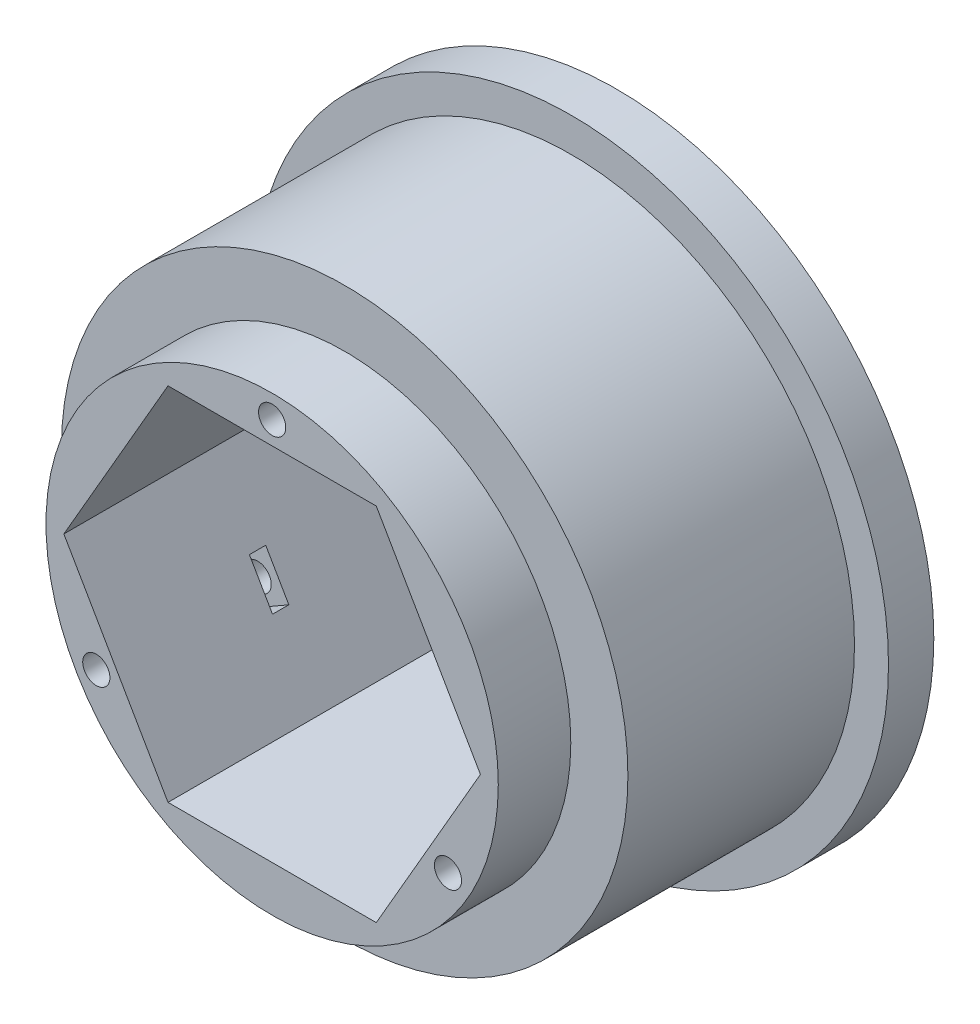
ISO-10303-21;
HEADER;
FILE_DESCRIPTION(('STEP AP214'),'2;1');
FILE_NAME('part.step','',(''),(''),'','','');
FILE_SCHEMA(('AUTOMOTIVE_DESIGN { 1 0 10303 214 1 1 1 1 }'));
ENDSEC;
DATA;
#1=APPLICATION_CONTEXT('core data for automotive mechanical design processes');
#2=APPLICATION_PROTOCOL_DEFINITION('international standard','automotive_design',2000,#1);
#3=PRODUCT_CONTEXT('',#1,'mechanical');
#4=PRODUCT('Part','Part','',(#3));
#5=PRODUCT_RELATED_PRODUCT_CATEGORY('part','',(#4));
#6=PRODUCT_DEFINITION_FORMATION('','',#4);
#7=PRODUCT_DEFINITION_CONTEXT('part definition',#1,'design');
#8=PRODUCT_DEFINITION('design','',#6,#7);
#9=PRODUCT_DEFINITION_SHAPE('','',#8);
#10=(LENGTH_UNIT() NAMED_UNIT(*) SI_UNIT(.MILLI.,.METRE.));
#11=(NAMED_UNIT(*) PLANE_ANGLE_UNIT() SI_UNIT($,.RADIAN.));
#12=(NAMED_UNIT(*) SI_UNIT($,.STERADIAN.) SOLID_ANGLE_UNIT());
#13=UNCERTAINTY_MEASURE_WITH_UNIT(LENGTH_MEASURE(1.E-05),#10,'distance_accuracy_value','');
#14=(GEOMETRIC_REPRESENTATION_CONTEXT(3) GLOBAL_UNCERTAINTY_ASSIGNED_CONTEXT((#13)) GLOBAL_UNIT_ASSIGNED_CONTEXT((#10,
#11,#12)) REPRESENTATION_CONTEXT('',''));
#15=CARTESIAN_POINT('',(0.,0.,0.));
#16=DIRECTION('',(0.,0.,1.));
#17=DIRECTION('',(1.,0.,0.));
#18=AXIS2_PLACEMENT_3D('',#15,#16,#17);
#19=CARTESIAN_POINT('',(42.,0.,5.00000000000001));
#20=DIRECTION('',(0.,0.,1.));
#21=DIRECTION('',(1.,0.,0.));
#22=AXIS2_PLACEMENT_3D('',#19,#20,#21);
#23=PLANE('',#22);
#24=CARTESIAN_POINT('',(0.,0.,5.00000000000001));
#25=DIRECTION('',(0.,0.,1.));
#26=DIRECTION('',(1.,0.,0.));
#27=AXIS2_PLACEMENT_3D('',#24,#25,#26);
#28=CIRCLE('',#27,31.25);
#29=CARTESIAN_POINT('',(31.25,0.,5.00000000000001));
#30=VERTEX_POINT('',#29);
#31=EDGE_CURVE('E340',#30,#30,#28,.T.);
#32=ORIENTED_EDGE('',*,*,#31,.F.);
#33=EDGE_LOOP('',(#32));
#34=FACE_BOUND('',#33,.T.);
#35=CARTESIAN_POINT('',(0.,0.,5.));
#36=DIRECTION('',(0.,0.,1.));
#37=DIRECTION('',(1.,0.,0.));
#38=AXIS2_PLACEMENT_3D('',#35,#36,#37);
#39=CIRCLE('',#38,35.);
#40=CARTESIAN_POINT('',(35.,0.,5.));
#41=VERTEX_POINT('',#40);
#42=EDGE_CURVE('E267',#41,#41,#39,.F.);
#43=ORIENTED_EDGE('',*,*,#42,.F.);
#44=EDGE_LOOP('',(#43));
#45=FACE_BOUND('',#44,.T.);
#46=ADVANCED_FACE('F44',(#34,#45),#23,.T.);
#47=CARTESIAN_POINT('',(28.1,0.,0.));
#48=DIRECTION('',(0.,0.,-1.));
#49=DIRECTION('',(-1.,0.,0.));
#50=AXIS2_PLACEMENT_3D('',#47,#48,#49);
#51=PLANE('',#50);
#52=CARTESIAN_POINT('',(0.,0.,0.));
#53=DIRECTION('',(0.,0.,1.));
#54=DIRECTION('',(1.,0.,0.));
#55=AXIS2_PLACEMENT_3D('',#52,#53,#54);
#56=CIRCLE('',#55,28.1);
#57=CARTESIAN_POINT('',(28.1,0.,0.));
#58=VERTEX_POINT('',#57);
#59=EDGE_CURVE('E337',#58,#58,#56,.T.);
#60=ORIENTED_EDGE('',*,*,#59,.T.);
#61=EDGE_LOOP('',(#60));
#62=FACE_BOUND('',#61,.T.);
#63=CARTESIAN_POINT('',(0.,0.,0.));
#64=DIRECTION('',(0.,0.,1.));
#65=DIRECTION('',(1.,0.,0.));
#66=AXIS2_PLACEMENT_3D('',#63,#64,#65);
#67=CIRCLE('',#66,35.);
#68=CARTESIAN_POINT('',(35.,0.,0.));
#69=VERTEX_POINT('',#68);
#70=EDGE_CURVE('E466',#69,#69,#67,.T.);
#71=ORIENTED_EDGE('',*,*,#70,.F.);
#72=EDGE_LOOP('',(#71));
#73=FACE_BOUND('',#72,.T.);
#74=ADVANCED_FACE('F408',(#62,#73),#51,.T.);
#75=CARTESIAN_POINT('',(-19.39896904477,-11.2000000000008,18.));
#76=DIRECTION('',(0.,0.,1.));
#77=DIRECTION('',(1.,0.,0.));
#78=AXIS2_PLACEMENT_3D('',#75,#76,#77);
#79=CYLINDRICAL_SURFACE('',#78,1.50000000000182);
#80=CARTESIAN_POINT('',(-19.39896904477,-11.2000000000008,38.));
#81=DIRECTION('',(0.,0.,1.));
#82=DIRECTION('',(1.,0.,0.));
#83=AXIS2_PLACEMENT_3D('',#80,#81,#82);
#84=CIRCLE('',#83,1.50000000000182);
#85=CARTESIAN_POINT('',(-17.8989690447682,-11.2000000000008,38.));
#86=VERTEX_POINT('',#85);
#87=EDGE_CURVE('E299',#86,#86,#84,.T.);
#88=ORIENTED_EDGE('',*,*,#87,.T.);
#89=EDGE_LOOP('',(#88));
#90=FACE_BOUND('',#89,.T.);
#91=CARTESIAN_POINT('',(-19.39896904477,-11.2000000000008,22.));
#92=DIRECTION('',(0.,0.,-1.));
#93=DIRECTION('',(-1.,0.,0.));
#94=AXIS2_PLACEMENT_3D('',#91,#92,#93);
#95=CIRCLE('',#94,1.50000000000182);
#96=CARTESIAN_POINT('',(-20.8989690447718,-11.2000000000008,22.));
#97=VERTEX_POINT('',#96);
#98=EDGE_CURVE('E379',#97,#97,#95,.F.);
#99=ORIENTED_EDGE('',*,*,#98,.F.);
#100=EDGE_LOOP('',(#99));
#101=FACE_BOUND('',#100,.T.);
#102=ADVANCED_FACE('F414',(#90,#101),#79,.F.);
#103=CARTESIAN_POINT('',(19.3989690447729,-11.1999999999992,18.));
#104=DIRECTION('',(0.,0.,1.));
#105=DIRECTION('',(1.,0.,0.));
#106=AXIS2_PLACEMENT_3D('',#103,#104,#105);
#107=CYLINDRICAL_SURFACE('',#106,1.50000000000123);
#108=CARTESIAN_POINT('',(19.3989690447729,-11.1999999999992,38.));
#109=DIRECTION('',(0.,0.,1.));
#110=DIRECTION('',(1.,0.,0.));
#111=AXIS2_PLACEMENT_3D('',#108,#109,#110);
#112=CIRCLE('',#111,1.50000000000123);
#113=CARTESIAN_POINT('',(20.8989690447741,-11.1999999999992,38.));
#114=VERTEX_POINT('',#113);
#115=EDGE_CURVE('E293',#114,#114,#112,.T.);
#116=ORIENTED_EDGE('',*,*,#115,.T.);
#117=EDGE_LOOP('',(#116));
#118=FACE_BOUND('',#117,.T.);
#119=CARTESIAN_POINT('',(19.3989690447729,-11.1999999999992,22.));
#120=DIRECTION('',(0.,0.,-1.));
#121=DIRECTION('',(-1.,0.,0.));
#122=AXIS2_PLACEMENT_3D('',#119,#120,#121);
#123=CIRCLE('',#122,1.50000000000123);
#124=CARTESIAN_POINT('',(17.8989690447716,-11.1999999999992,22.));
#125=VERTEX_POINT('',#124);
#126=EDGE_CURVE('E374',#125,#125,#123,.F.);
#127=ORIENTED_EDGE('',*,*,#126,.F.);
#128=EDGE_LOOP('',(#127));
#129=FACE_BOUND('',#128,.T.);
#130=ADVANCED_FACE('F405',(#118,#129),#107,.F.);
#131=CARTESIAN_POINT('',(0.,22.4,18.));
#132=DIRECTION('',(0.,0.,1.));
#133=DIRECTION('',(1.,0.,0.));
#134=AXIS2_PLACEMENT_3D('',#131,#132,#133);
#135=CYLINDRICAL_SURFACE('',#134,1.5);
#136=CARTESIAN_POINT('',(0.,22.4,38.));
#137=DIRECTION('',(0.,0.,1.));
#138=DIRECTION('',(1.,0.,0.));
#139=AXIS2_PLACEMENT_3D('',#136,#137,#138);
#140=CIRCLE('',#139,1.5);
#141=CARTESIAN_POINT('',(1.50000000000001,22.4,38.));
#142=VERTEX_POINT('',#141);
#143=EDGE_CURVE('E287',#142,#142,#140,.T.);
#144=ORIENTED_EDGE('',*,*,#143,.T.);
#145=EDGE_LOOP('',(#144));
#146=FACE_BOUND('',#145,.T.);
#147=CARTESIAN_POINT('',(0.,22.4,22.));
#148=DIRECTION('',(0.,0.,-1.));
#149=DIRECTION('',(-1.,0.,0.));
#150=AXIS2_PLACEMENT_3D('',#147,#148,#149);
#151=CIRCLE('',#150,1.5);
#152=CARTESIAN_POINT('',(-1.5,22.4,22.));
#153=VERTEX_POINT('',#152);
#154=EDGE_CURVE('E214',#153,#153,#151,.F.);
#155=ORIENTED_EDGE('',*,*,#154,.F.);
#156=EDGE_LOOP('',(#155));
#157=FACE_BOUND('',#156,.T.);
#158=ADVANCED_FACE('F443',(#146,#157),#135,.F.);
#159=CARTESIAN_POINT('',(0.,0.,57.8257955505955));
#160=DIRECTION('',(0.,0.,1.));
#161=DIRECTION('',(1.,0.,0.));
#162=AXIS2_PLACEMENT_3D('',#159,#160,#161);
#163=CYLINDRICAL_SURFACE('',#162,24.95);
#164=CARTESIAN_POINT('',(0.,0.,5.));
#165=DIRECTION('',(0.,0.,1.));
#166=DIRECTION('',(1.,0.,0.));
#167=AXIS2_PLACEMENT_3D('',#164,#165,#166);
#168=CIRCLE('',#167,24.95);
#169=CARTESIAN_POINT('',(24.95,0.,5.));
#170=VERTEX_POINT('',#169);
#171=EDGE_CURVE('E352',#170,#170,#168,.T.);
#172=ORIENTED_EDGE('',*,*,#171,.T.);
#173=EDGE_LOOP('',(#172));
#174=FACE_BOUND('',#173,.T.);
#175=CARTESIAN_POINT('',(0.,0.,10.));
#176=DIRECTION('',(0.,0.,1.));
#177=DIRECTION('',(1.,0.,0.));
#178=AXIS2_PLACEMENT_3D('',#175,#176,#177);
#179=CIRCLE('',#178,24.95);
#180=CARTESIAN_POINT('',(24.95,0.,10.));
#181=VERTEX_POINT('',#180);
#182=EDGE_CURVE('E331',#181,#181,#179,.T.);
#183=ORIENTED_EDGE('',*,*,#182,.F.);
#184=EDGE_LOOP('',(#183));
#185=FACE_BOUND('',#184,.T.);
#186=ADVANCED_FACE('F46',(#174,#185),#163,.T.);
#187=CARTESIAN_POINT('',(19.9,0.,5.));
#188=DIRECTION('',(0.,0.,-1.));
#189=DIRECTION('',(-1.,0.,0.));
#190=AXIS2_PLACEMENT_3D('',#187,#188,#189);
#191=PLANE('',#190);
#192=DIRECTION('',(0.5,0.866025403784439,0.));
#193=VECTOR('',#192,1.);
#194=CARTESIAN_POINT('',(-12.2589055353103,18.5669527676552,5.));
#195=LINE('',#194,#193);
#196=CARTESIAN_POINT('',(-22.9785407137471,0.,5.));
#197=VERTEX_POINT('',#196);
#198=CARTESIAN_POINT('',(-11.4892703568736,19.9,5.));
#199=VERTEX_POINT('',#198);
#200=EDGE_CURVE('E329',#197,#199,#195,.T.);
#201=ORIENTED_EDGE('',*,*,#200,.F.);
#202=DIRECTION('',(-0.5,0.866025403784439,0.));
#203=VECTOR('',#202,1.);
#204=CARTESIAN_POINT('',(-12.2589055353103,-18.5669527676552,5.));
#205=LINE('',#204,#203);
#206=CARTESIAN_POINT('',(-11.4892703568736,-19.9,5.));
#207=VERTEX_POINT('',#206);
#208=EDGE_CURVE('E305',#207,#197,#205,.T.);
#209=ORIENTED_EDGE('',*,*,#208,.F.);
#210=DIRECTION('',(-1.,0.,0.));
#211=VECTOR('',#210,1.);
#212=CARTESIAN_POINT('',(19.9,-19.9,5.));
#213=LINE('',#212,#211);
#214=CARTESIAN_POINT('',(11.4892703568736,-19.9,5.));
#215=VERTEX_POINT('',#214);
#216=EDGE_CURVE('E321',#215,#207,#213,.T.);
#217=ORIENTED_EDGE('',*,*,#216,.F.);
#218=DIRECTION('',(-0.5,-0.866025403784439,0.));
#219=VECTOR('',#218,1.);
#220=CARTESIAN_POINT('',(22.2089055353103,-1.33304723234484,5.));
#221=LINE('',#220,#219);
#222=CARTESIAN_POINT('',(22.9785407137471,0.,5.));
#223=VERTEX_POINT('',#222);
#224=EDGE_CURVE('E323',#223,#215,#221,.T.);
#225=ORIENTED_EDGE('',*,*,#224,.F.);
#226=DIRECTION('',(0.5,-0.866025403784439,0.));
#227=VECTOR('',#226,1.);
#228=CARTESIAN_POINT('',(22.2089055353103,1.33304723234484,5.));
#229=LINE('',#228,#227);
#230=CARTESIAN_POINT('',(11.4892703568736,19.9,5.));
#231=VERTEX_POINT('',#230);
#232=EDGE_CURVE('E325',#231,#223,#229,.T.);
#233=ORIENTED_EDGE('',*,*,#232,.F.);
#234=DIRECTION('',(1.,0.,0.));
#235=VECTOR('',#234,1.);
#236=CARTESIAN_POINT('',(19.9,19.9,5.));
#237=LINE('',#236,#235);
#238=EDGE_CURVE('E327',#199,#231,#237,.T.);
#239=ORIENTED_EDGE('',*,*,#238,.F.);
#240=EDGE_LOOP('',(#201,#209,#217,#225,#233,#239));
#241=FACE_BOUND('',#240,.T.);
#242=ORIENTED_EDGE('',*,*,#171,.F.);
#243=EDGE_LOOP('',(#242));
#244=FACE_BOUND('',#243,.T.);
#245=ADVANCED_FACE('F436',(#241,#244),#191,.T.);
#246=CARTESIAN_POINT('',(24.95,0.,38.));
#247=DIRECTION('',(0.,0.,1.));
#248=DIRECTION('',(1.,0.,0.));
#249=AXIS2_PLACEMENT_3D('',#246,#247,#248);
#250=PLANE('',#249);
#251=ORIENTED_EDGE('',*,*,#143,.F.);
#252=EDGE_LOOP('',(#251));
#253=FACE_BOUND('',#252,.T.);
#254=ORIENTED_EDGE('',*,*,#115,.F.);
#255=EDGE_LOOP('',(#254));
#256=FACE_BOUND('',#255,.T.);
#257=ORIENTED_EDGE('',*,*,#87,.F.);
#258=EDGE_LOOP('',(#257));
#259=FACE_BOUND('',#258,.T.);
#260=DIRECTION('',(-0.5,0.866025403784439,0.));
#261=VECTOR('',#260,1.);
#262=CARTESIAN_POINT('',(23.4714055353103,-0.853666912210862,38.));
#263=LINE('',#262,#261);
#264=CARTESIAN_POINT('',(22.9785407137471,0.,38.));
#265=VERTEX_POINT('',#264);
#266=CARTESIAN_POINT('',(11.4892703568736,19.9,38.));
#267=VERTEX_POINT('',#266);
#268=EDGE_CURVE('E12',#265,#267,#263,.T.);
#269=ORIENTED_EDGE('',*,*,#268,.F.);
#270=DIRECTION('',(0.5,0.866025403784439,0.));
#271=VECTOR('',#270,1.);
#272=CARTESIAN_POINT('',(23.4714055353103,0.853666912210868,38.));
#273=LINE('',#272,#271);
#274=CARTESIAN_POINT('',(11.4892703568736,-19.9,38.));
#275=VERTEX_POINT('',#274);
#276=EDGE_CURVE('E53',#275,#265,#273,.T.);
#277=ORIENTED_EDGE('',*,*,#276,.F.);
#278=DIRECTION('',(1.,0.,0.));
#279=VECTOR('',#278,1.);
#280=CARTESIAN_POINT('',(24.95,-19.9,38.));
#281=LINE('',#280,#279);
#282=CARTESIAN_POINT('',(-11.4892703568736,-19.9,38.));
#283=VERTEX_POINT('',#282);
#284=EDGE_CURVE('E359',#283,#275,#281,.T.);
#285=ORIENTED_EDGE('',*,*,#284,.F.);
#286=DIRECTION('',(0.5,-0.866025403784439,0.));
#287=VECTOR('',#286,1.);
#288=CARTESIAN_POINT('',(-10.9964055353103,-20.7536669122109,38.));
#289=LINE('',#288,#287);
#290=CARTESIAN_POINT('',(-22.9785407137471,0.,38.));
#291=VERTEX_POINT('',#290);
#292=EDGE_CURVE('E355',#291,#283,#289,.T.);
#293=ORIENTED_EDGE('',*,*,#292,.F.);
#294=DIRECTION('',(-0.5,-0.866025403784439,0.));
#295=VECTOR('',#294,1.);
#296=CARTESIAN_POINT('',(-10.9964055353103,20.7536669122109,38.));
#297=LINE('',#296,#295);
#298=CARTESIAN_POINT('',(-11.4892703568736,19.9,38.));
#299=VERTEX_POINT('',#298);
#300=EDGE_CURVE('E358',#299,#291,#297,.T.);
#301=ORIENTED_EDGE('',*,*,#300,.F.);
#302=DIRECTION('',(-1.,0.,0.));
#303=VECTOR('',#302,1.);
#304=CARTESIAN_POINT('',(24.95,19.9,38.));
#305=LINE('',#304,#303);
#306=EDGE_CURVE('E362',#267,#299,#305,.T.);
#307=ORIENTED_EDGE('',*,*,#306,.F.);
#308=EDGE_LOOP('',(#269,#277,#285,#293,#301,#307));
#309=FACE_BOUND('',#308,.T.);
#310=CARTESIAN_POINT('',(0.,0.,38.));
#311=DIRECTION('',(0.,0.,1.));
#312=DIRECTION('',(1.,0.,0.));
#313=AXIS2_PLACEMENT_3D('',#310,#311,#312);
#314=CIRCLE('',#313,24.95);
#315=CARTESIAN_POINT('',(24.95,0.,38.));
#316=VERTEX_POINT('',#315);
#317=EDGE_CURVE('E349',#316,#316,#314,.T.);
#318=ORIENTED_EDGE('',*,*,#317,.T.);
#319=EDGE_LOOP('',(#318));
#320=FACE_BOUND('',#319,.T.);
#321=ADVANCED_FACE('F433',(#253,#256,#259,#309,#320),#250,.T.);
#322=CARTESIAN_POINT('',(0.,0.,57.8257955505955));
#323=DIRECTION('',(0.,0.,1.));
#324=DIRECTION('',(1.,0.,0.));
#325=AXIS2_PLACEMENT_3D('',#322,#323,#324);
#326=CYLINDRICAL_SURFACE('',#325,24.95);
#327=CARTESIAN_POINT('',(0.,0.,30.));
#328=DIRECTION('',(0.,0.,1.));
#329=DIRECTION('',(1.,0.,0.));
#330=AXIS2_PLACEMENT_3D('',#327,#328,#329);
#331=CIRCLE('',#330,24.95);
#332=CARTESIAN_POINT('',(24.95,0.,30.));
#333=VERTEX_POINT('',#332);
#334=EDGE_CURVE('E346',#333,#333,#331,.T.);
#335=ORIENTED_EDGE('',*,*,#334,.T.);
#336=EDGE_LOOP('',(#335));
#337=FACE_BOUND('',#336,.T.);
#338=ORIENTED_EDGE('',*,*,#317,.F.);
#339=EDGE_LOOP('',(#338));
#340=FACE_BOUND('',#339,.T.);
#341=ADVANCED_FACE('F429',(#337,#340),#326,.T.);
#342=CARTESIAN_POINT('',(31.25,0.,30.));
#343=DIRECTION('',(0.,0.,1.));
#344=DIRECTION('',(1.,0.,0.));
#345=AXIS2_PLACEMENT_3D('',#342,#343,#344);
#346=PLANE('',#345);
#347=CARTESIAN_POINT('',(0.,0.,30.));
#348=DIRECTION('',(0.,0.,1.));
#349=DIRECTION('',(1.,0.,0.));
#350=AXIS2_PLACEMENT_3D('',#347,#348,#349);
#351=CIRCLE('',#350,31.25);
#352=CARTESIAN_POINT('',(31.25,0.,30.));
#353=VERTEX_POINT('',#352);
#354=EDGE_CURVE('E343',#353,#353,#351,.T.);
#355=ORIENTED_EDGE('',*,*,#354,.T.);
#356=EDGE_LOOP('',(#355));
#357=FACE_BOUND('',#356,.T.);
#358=ORIENTED_EDGE('',*,*,#334,.F.);
#359=EDGE_LOOP('',(#358));
#360=FACE_BOUND('',#359,.T.);
#361=ADVANCED_FACE('F425',(#357,#360),#346,.T.);
#362=CARTESIAN_POINT('',(0.,0.,57.8257955505955));
#363=DIRECTION('',(0.,0.,1.));
#364=DIRECTION('',(1.,0.,0.));
#365=AXIS2_PLACEMENT_3D('',#362,#363,#364);
#366=CYLINDRICAL_SURFACE('',#365,31.25);
#367=ORIENTED_EDGE('',*,*,#31,.T.);
#368=EDGE_LOOP('',(#367));
#369=FACE_BOUND('',#368,.T.);
#370=ORIENTED_EDGE('',*,*,#354,.F.);
#371=EDGE_LOOP('',(#370));
#372=FACE_BOUND('',#371,.T.);
#373=ADVANCED_FACE('F421',(#369,#372),#366,.T.);
#374=CARTESIAN_POINT('',(0.,0.,57.8257955505955));
#375=DIRECTION('',(0.,0.,1.));
#376=DIRECTION('',(1.,0.,0.));
#377=AXIS2_PLACEMENT_3D('',#374,#375,#376);
#378=CYLINDRICAL_SURFACE('',#377,28.1);
#379=CARTESIAN_POINT('',(0.,0.,10.));
#380=DIRECTION('',(0.,0.,1.));
#381=DIRECTION('',(1.,0.,0.));
#382=AXIS2_PLACEMENT_3D('',#379,#380,#381);
#383=CIRCLE('',#382,28.1);
#384=CARTESIAN_POINT('',(28.1,0.,10.));
#385=VERTEX_POINT('',#384);
#386=EDGE_CURVE('E334',#385,#385,#383,.T.);
#387=ORIENTED_EDGE('',*,*,#386,.T.);
#388=EDGE_LOOP('',(#387));
#389=FACE_BOUND('',#388,.T.);
#390=ORIENTED_EDGE('',*,*,#59,.F.);
#391=EDGE_LOOP('',(#390));
#392=FACE_BOUND('',#391,.T.);
#393=ADVANCED_FACE('F424',(#389,#392),#378,.F.);
#394=CARTESIAN_POINT('',(24.95,0.,10.));
#395=DIRECTION('',(0.,0.,-1.));
#396=DIRECTION('',(-1.,0.,0.));
#397=AXIS2_PLACEMENT_3D('',#394,#395,#396);
#398=PLANE('',#397);
#399=ORIENTED_EDGE('',*,*,#182,.T.);
#400=EDGE_LOOP('',(#399));
#401=FACE_BOUND('',#400,.T.);
#402=ORIENTED_EDGE('',*,*,#386,.F.);
#403=EDGE_LOOP('',(#402));
#404=FACE_BOUND('',#403,.T.);
#405=ADVANCED_FACE('F453',(#401,#404),#398,.T.);
#406=CARTESIAN_POINT('',(-11.4892703568736,19.9,0.));
#407=DIRECTION('',(-0.866025403784439,0.5,0.));
#408=DIRECTION('',(-0.5,-0.866025403784439,0.));
#409=AXIS2_PLACEMENT_3D('',#406,#407,#408);
#410=PLANE('',#409);
#411=ORIENTED_EDGE('',*,*,#200,.T.);
#412=DIRECTION('',(0.,0.,1.));
#413=VECTOR('',#412,1.);
#414=CARTESIAN_POINT('',(-11.4892703568736,19.9,0.));
#415=LINE('',#414,#413);
#416=EDGE_CURVE('E302',#199,#299,#415,.T.);
#417=ORIENTED_EDGE('',*,*,#416,.T.);
#418=ORIENTED_EDGE('',*,*,#300,.T.);
#419=DIRECTION('',(0.,0.,1.));
#420=VECTOR('',#419,1.);
#421=CARTESIAN_POINT('',(-22.9785407137471,0.,0.));
#422=LINE('',#421,#420);
#423=EDGE_CURVE('E286',#197,#291,#422,.T.);
#424=ORIENTED_EDGE('',*,*,#423,.F.);
#425=EDGE_LOOP('',(#411,#417,#418,#424));
#426=FACE_BOUND('',#425,.T.);
#427=ADVANCED_FACE('F456',(#426),#410,.F.);
#428=CARTESIAN_POINT('',(11.4892703568736,19.9,0.));
#429=DIRECTION('',(0.,1.,0.));
#430=DIRECTION('',(-1.,0.,0.));
#431=AXIS2_PLACEMENT_3D('',#428,#429,#430);
#432=PLANE('',#431);
#433=DIRECTION('',(0.,0.,1.));
#434=VECTOR('',#433,1.);
#435=CARTESIAN_POINT('',(2.55,19.9,20.2));
#436=LINE('',#435,#434);
#437=CARTESIAN_POINT('',(2.55,19.9,20.2));
#438=VERTEX_POINT('',#437);
#439=CARTESIAN_POINT('',(2.55,19.9,22.));
#440=VERTEX_POINT('',#439);
#441=EDGE_CURVE('E184',#438,#440,#436,.T.);
#442=ORIENTED_EDGE('',*,*,#441,.F.);
#443=DIRECTION('',(1.,0.,0.));
#444=VECTOR('',#443,1.);
#445=CARTESIAN_POINT('',(-2.55,19.9,20.2));
#446=LINE('',#445,#444);
#447=CARTESIAN_POINT('',(-2.55,19.9,20.2));
#448=VERTEX_POINT('',#447);
#449=EDGE_CURVE('E192',#448,#438,#446,.T.);
#450=ORIENTED_EDGE('',*,*,#449,.F.);
#451=DIRECTION('',(0.,0.,1.));
#452=VECTOR('',#451,1.);
#453=CARTESIAN_POINT('',(-2.55,19.9,20.2));
#454=LINE('',#453,#452);
#455=CARTESIAN_POINT('',(-2.55,19.9,22.));
#456=VERTEX_POINT('',#455);
#457=EDGE_CURVE('E174',#448,#456,#454,.T.);
#458=ORIENTED_EDGE('',*,*,#457,.T.);
#459=DIRECTION('',(1.,0.,0.));
#460=VECTOR('',#459,1.);
#461=CARTESIAN_POINT('',(-2.55,19.9,22.));
#462=LINE('',#461,#460);
#463=EDGE_CURVE('E206',#456,#440,#462,.T.);
#464=ORIENTED_EDGE('',*,*,#463,.T.);
#465=EDGE_LOOP('',(#442,#450,#458,#464));
#466=FACE_BOUND('',#465,.T.);
#467=ORIENTED_EDGE('',*,*,#238,.T.);
#468=DIRECTION('',(0.,0.,1.));
#469=VECTOR('',#468,1.);
#470=CARTESIAN_POINT('',(11.4892703568736,19.9,0.));
#471=LINE('',#470,#469);
#472=EDGE_CURVE('E306',#231,#267,#471,.T.);
#473=ORIENTED_EDGE('',*,*,#472,.T.);
#474=ORIENTED_EDGE('',*,*,#306,.T.);
#475=ORIENTED_EDGE('',*,*,#416,.F.);
#476=EDGE_LOOP('',(#467,#473,#474,#475));
#477=FACE_BOUND('',#476,.T.);
#478=ADVANCED_FACE('F197',(#466,#477),#432,.F.);
#479=CARTESIAN_POINT('',(22.9785407137471,0.,0.));
#480=DIRECTION('',(0.866025403784439,0.5,0.));
#481=DIRECTION('',(-0.5,0.866025403784439,0.));
#482=AXIS2_PLACEMENT_3D('',#479,#480,#481);
#483=PLANE('',#482);
#484=ORIENTED_EDGE('',*,*,#232,.T.);
#485=DIRECTION('',(0.,0.,1.));
#486=VECTOR('',#485,1.);
#487=CARTESIAN_POINT('',(22.9785407137471,0.,0.));
#488=LINE('',#487,#486);
#489=EDGE_CURVE('E309',#223,#265,#488,.T.);
#490=ORIENTED_EDGE('',*,*,#489,.T.);
#491=ORIENTED_EDGE('',*,*,#268,.T.);
#492=ORIENTED_EDGE('',*,*,#472,.F.);
#493=EDGE_LOOP('',(#484,#490,#491,#492));
#494=FACE_BOUND('',#493,.T.);
#495=ADVANCED_FACE('F547',(#494),#483,.F.);
#496=CARTESIAN_POINT('',(11.4892703568736,-19.9,0.));
#497=DIRECTION('',(0.866025403784439,-0.5,0.));
#498=DIRECTION('',(0.5,0.866025403784439,0.));
#499=AXIS2_PLACEMENT_3D('',#496,#497,#498);
#500=PLANE('',#499);
#501=DIRECTION('',(0.,0.,1.));
#502=VECTOR('',#501,1.);
#503=CARTESIAN_POINT('',(15.9589055353111,-12.1583647796497,20.2));
#504=LINE('',#503,#502);
#505=CARTESIAN_POINT('',(15.9589055353111,-12.1583647796497,20.2));
#506=VERTEX_POINT('',#505);
#507=CARTESIAN_POINT('',(15.9589055353111,-12.158364779649,22.));
#508=VERTEX_POINT('',#507);
#509=EDGE_CURVE('E245',#506,#508,#504,.T.);
#510=ORIENTED_EDGE('',*,*,#509,.F.);
#511=DIRECTION('',(-0.5,-0.866025403784439,0.));
#512=VECTOR('',#511,1.);
#513=CARTESIAN_POINT('',(18.5089055353111,-7.74163522034909,20.2));
#514=LINE('',#513,#512);
#515=CARTESIAN_POINT('',(18.5089055353111,-7.74163522034909,20.2));
#516=VERTEX_POINT('',#515);
#517=EDGE_CURVE('E221',#516,#506,#514,.T.);
#518=ORIENTED_EDGE('',*,*,#517,.F.);
#519=DIRECTION('',(0.,0.,1.));
#520=VECTOR('',#519,1.);
#521=CARTESIAN_POINT('',(18.5089055353111,-7.74163522034909,20.2));
#522=LINE('',#521,#520);
#523=CARTESIAN_POINT('',(18.5089055353111,-7.74163522034909,22.));
#524=VERTEX_POINT('',#523);
#525=EDGE_CURVE('E231',#516,#524,#522,.T.);
#526=ORIENTED_EDGE('',*,*,#525,.T.);
#527=DIRECTION('',(-0.5,-0.866025403784439,0.));
#528=VECTOR('',#527,1.);
#529=CARTESIAN_POINT('',(18.5089055353111,-7.74163522034909,22.));
#530=LINE('',#529,#528);
#531=EDGE_CURVE('E235',#524,#508,#530,.T.);
#532=ORIENTED_EDGE('',*,*,#531,.T.);
#533=EDGE_LOOP('',(#510,#518,#526,#532));
#534=FACE_BOUND('',#533,.T.);
#535=ORIENTED_EDGE('',*,*,#224,.T.);
#536=DIRECTION('',(0.,0.,1.));
#537=VECTOR('',#536,1.);
#538=CARTESIAN_POINT('',(11.4892703568736,-19.9,0.));
#539=LINE('',#538,#537);
#540=EDGE_CURVE('E312',#215,#275,#539,.T.);
#541=ORIENTED_EDGE('',*,*,#540,.T.);
#542=ORIENTED_EDGE('',*,*,#276,.T.);
#543=ORIENTED_EDGE('',*,*,#489,.F.);
#544=EDGE_LOOP('',(#535,#541,#542,#543));
#545=FACE_BOUND('',#544,.T.);
#546=ADVANCED_FACE('F523',(#534,#545),#500,.F.);
#547=CARTESIAN_POINT('',(-11.4892703568736,-19.9,0.));
#548=DIRECTION('',(0.,-1.,0.));
#549=DIRECTION('',(1.,0.,0.));
#550=AXIS2_PLACEMENT_3D('',#547,#548,#549);
#551=PLANE('',#550);
#552=ORIENTED_EDGE('',*,*,#216,.T.);
#553=DIRECTION('',(0.,0.,1.));
#554=VECTOR('',#553,1.);
#555=CARTESIAN_POINT('',(-11.4892703568736,-19.9,0.));
#556=LINE('',#555,#554);
#557=EDGE_CURVE('E315',#207,#283,#556,.T.);
#558=ORIENTED_EDGE('',*,*,#557,.T.);
#559=ORIENTED_EDGE('',*,*,#284,.T.);
#560=ORIENTED_EDGE('',*,*,#540,.F.);
#561=EDGE_LOOP('',(#552,#558,#559,#560));
#562=FACE_BOUND('',#561,.T.);
#563=ADVANCED_FACE('F553',(#562),#551,.F.);
#564=CARTESIAN_POINT('',(-22.9785407137471,0.,0.));
#565=DIRECTION('',(-0.866025403784439,-0.5,0.));
#566=DIRECTION('',(0.5,-0.866025403784439,0.));
#567=AXIS2_PLACEMENT_3D('',#564,#565,#566);
#568=PLANE('',#567);
#569=DIRECTION('',(0.,0.,1.));
#570=VECTOR('',#569,1.);
#571=CARTESIAN_POINT('',(-18.5089055353094,-7.74163522035007,20.2));
#572=LINE('',#571,#570);
#573=CARTESIAN_POINT('',(-18.5089055353094,-7.74163522035007,20.2));
#574=VERTEX_POINT('',#573);
#575=CARTESIAN_POINT('',(-18.5089055353101,-7.74163522035007,22.));
#576=VERTEX_POINT('',#575);
#577=EDGE_CURVE('E278',#574,#576,#572,.T.);
#578=ORIENTED_EDGE('',*,*,#577,.F.);
#579=DIRECTION('',(-0.5,0.866025403784439,0.));
#580=VECTOR('',#579,1.);
#581=CARTESIAN_POINT('',(-15.9589055353094,-12.1583647796507,20.2));
#582=LINE('',#581,#580);
#583=CARTESIAN_POINT('',(-15.9589055353094,-12.1583647796507,20.2));
#584=VERTEX_POINT('',#583);
#585=EDGE_CURVE('E252',#584,#574,#582,.T.);
#586=ORIENTED_EDGE('',*,*,#585,.F.);
#587=DIRECTION('',(0.,0.,1.));
#588=VECTOR('',#587,1.);
#589=CARTESIAN_POINT('',(-15.9589055353094,-12.1583647796507,20.2));
#590=LINE('',#589,#588);
#591=CARTESIAN_POINT('',(-15.9589055353094,-12.1583647796507,22.));
#592=VERTEX_POINT('',#591);
#593=EDGE_CURVE('E262',#584,#592,#590,.T.);
#594=ORIENTED_EDGE('',*,*,#593,.T.);
#595=DIRECTION('',(-0.5,0.866025403784439,0.));
#596=VECTOR('',#595,1.);
#597=CARTESIAN_POINT('',(-15.9589055353094,-12.1583647796507,22.));
#598=LINE('',#597,#596);
#599=EDGE_CURVE('E266',#592,#576,#598,.T.);
#600=ORIENTED_EDGE('',*,*,#599,.T.);
#601=EDGE_LOOP('',(#578,#586,#594,#600));
#602=FACE_BOUND('',#601,.T.);
#603=ORIENTED_EDGE('',*,*,#208,.T.);
#604=ORIENTED_EDGE('',*,*,#423,.T.);
#605=ORIENTED_EDGE('',*,*,#292,.T.);
#606=ORIENTED_EDGE('',*,*,#557,.F.);
#607=EDGE_LOOP('',(#603,#604,#605,#606));
#608=FACE_BOUND('',#607,.T.);
#609=ADVANCED_FACE('F484',(#602,#608),#568,.F.);
#610=CARTESIAN_POINT('',(0.,0.,20.2));
#611=DIRECTION('',(0.,0.,-1.));
#612=DIRECTION('',(-1.,0.,0.));
#613=AXIS2_PLACEMENT_3D('',#610,#611,#612);
#614=PLANE('',#613);
#615=DIRECTION('',(0.,-1.,0.));
#616=VECTOR('',#615,1.);
#617=CARTESIAN_POINT('',(-2.55,19.9,20.2));
#618=LINE('',#617,#616);
#619=CARTESIAN_POINT('',(-2.55,24.95,20.2));
#620=VERTEX_POINT('',#619);
#621=EDGE_CURVE('E177',#620,#448,#618,.T.);
#622=ORIENTED_EDGE('',*,*,#621,.T.);
#623=ORIENTED_EDGE('',*,*,#449,.T.);
#624=DIRECTION('',(0.,1.,0.));
#625=VECTOR('',#624,1.);
#626=CARTESIAN_POINT('',(2.55,24.95,20.2));
#627=LINE('',#626,#625);
#628=CARTESIAN_POINT('',(2.55,24.95,20.2));
#629=VERTEX_POINT('',#628);
#630=EDGE_CURVE('E199',#438,#629,#627,.T.);
#631=ORIENTED_EDGE('',*,*,#630,.T.);
#632=DIRECTION('',(-1.,0.,0.));
#633=VECTOR('',#632,1.);
#634=CARTESIAN_POINT('',(-2.55,24.95,20.2));
#635=LINE('',#634,#633);
#636=EDGE_CURVE('E185',#629,#620,#635,.T.);
#637=ORIENTED_EDGE('',*,*,#636,.T.);
#638=EDGE_LOOP('',(#622,#623,#631,#637));
#639=FACE_BOUND('',#638,.T.);
#640=CARTESIAN_POINT('',(0.,22.4,20.2));
#641=DIRECTION('',(0.,0.,-1.));
#642=DIRECTION('',(-1.,0.,0.));
#643=AXIS2_PLACEMENT_3D('',#640,#641,#642);
#644=CIRCLE('',#643,1.5);
#645=CARTESIAN_POINT('',(-1.5,22.4,20.2));
#646=VERTEX_POINT('',#645);
#647=EDGE_CURVE('E371',#646,#646,#644,.F.);
#648=ORIENTED_EDGE('',*,*,#647,.F.);
#649=EDGE_LOOP('',(#648));
#650=FACE_BOUND('',#649,.T.);
#651=ADVANCED_FACE('F189',(#639,#650),#614,.F.);
#652=CARTESIAN_POINT('',(0.,0.,22.));
#653=DIRECTION('',(0.,0.,-1.));
#654=DIRECTION('',(-1.,0.,0.));
#655=AXIS2_PLACEMENT_3D('',#652,#653,#654);
#656=PLANE('',#655);
#657=DIRECTION('',(0.,-1.,0.));
#658=VECTOR('',#657,1.);
#659=CARTESIAN_POINT('',(-2.55,19.9,22.));
#660=LINE('',#659,#658);
#661=CARTESIAN_POINT('',(-2.55,24.95,22.));
#662=VERTEX_POINT('',#661);
#663=EDGE_CURVE('E180',#662,#456,#660,.T.);
#664=ORIENTED_EDGE('',*,*,#663,.F.);
#665=DIRECTION('',(-1.,0.,0.));
#666=VECTOR('',#665,1.);
#667=CARTESIAN_POINT('',(-2.55,24.95,22.));
#668=LINE('',#667,#666);
#669=CARTESIAN_POINT('',(2.55,24.95,22.));
#670=VERTEX_POINT('',#669);
#671=EDGE_CURVE('E195',#670,#662,#668,.T.);
#672=ORIENTED_EDGE('',*,*,#671,.F.);
#673=DIRECTION('',(0.,1.,0.));
#674=VECTOR('',#673,1.);
#675=CARTESIAN_POINT('',(2.55,24.95,22.));
#676=LINE('',#675,#674);
#677=EDGE_CURVE('E61',#440,#670,#676,.T.);
#678=ORIENTED_EDGE('',*,*,#677,.F.);
#679=ORIENTED_EDGE('',*,*,#463,.F.);
#680=EDGE_LOOP('',(#664,#672,#678,#679));
#681=FACE_BOUND('',#680,.T.);
#682=ORIENTED_EDGE('',*,*,#154,.T.);
#683=EDGE_LOOP('',(#682));
#684=FACE_BOUND('',#683,.T.);
#685=ADVANCED_FACE('F483',(#681,#684),#656,.T.);
#686=CARTESIAN_POINT('',(-2.55,19.9,20.2));
#687=DIRECTION('',(-1.,0.,0.));
#688=DIRECTION('',(0.,-1.,0.));
#689=AXIS2_PLACEMENT_3D('',#686,#687,#688);
#690=PLANE('',#689);
#691=ORIENTED_EDGE('',*,*,#663,.T.);
#692=ORIENTED_EDGE('',*,*,#457,.F.);
#693=ORIENTED_EDGE('',*,*,#621,.F.);
#694=DIRECTION('',(0.,0.,1.));
#695=VECTOR('',#694,1.);
#696=CARTESIAN_POINT('',(-2.55,24.95,20.2));
#697=LINE('',#696,#695);
#698=EDGE_CURVE('E212',#620,#662,#697,.T.);
#699=ORIENTED_EDGE('',*,*,#698,.T.);
#700=EDGE_LOOP('',(#691,#692,#693,#699));
#701=FACE_BOUND('',#700,.T.);
#702=ADVANCED_FACE('F176',(#701),#690,.F.);
#703=CARTESIAN_POINT('',(-2.55,24.95,20.2));
#704=DIRECTION('',(0.,1.,0.));
#705=DIRECTION('',(0.,0.,1.));
#706=AXIS2_PLACEMENT_3D('',#703,#704,#705);
#707=PLANE('',#706);
#708=ORIENTED_EDGE('',*,*,#671,.T.);
#709=ORIENTED_EDGE('',*,*,#698,.F.);
#710=ORIENTED_EDGE('',*,*,#636,.F.);
#711=DIRECTION('',(0.,0.,1.));
#712=VECTOR('',#711,1.);
#713=CARTESIAN_POINT('',(2.55,24.95,20.2));
#714=LINE('',#713,#712);
#715=EDGE_CURVE('E215',#629,#670,#714,.T.);
#716=ORIENTED_EDGE('',*,*,#715,.T.);
#717=EDGE_LOOP('',(#708,#709,#710,#716));
#718=FACE_BOUND('',#717,.T.);
#719=ADVANCED_FACE('F487',(#718),#707,.F.);
#720=CARTESIAN_POINT('',(2.55,24.95,20.2));
#721=DIRECTION('',(1.,0.,0.));
#722=DIRECTION('',(0.,0.,-1.));
#723=AXIS2_PLACEMENT_3D('',#720,#721,#722);
#724=PLANE('',#723);
#725=ORIENTED_EDGE('',*,*,#677,.T.);
#726=ORIENTED_EDGE('',*,*,#715,.F.);
#727=ORIENTED_EDGE('',*,*,#630,.F.);
#728=ORIENTED_EDGE('',*,*,#441,.T.);
#729=EDGE_LOOP('',(#725,#726,#727,#728));
#730=FACE_BOUND('',#729,.T.);
#731=ADVANCED_FACE('F490',(#730),#724,.F.);
#732=CARTESIAN_POINT('',(0.,22.4,18.));
#733=DIRECTION('',(0.,0.,1.));
#734=DIRECTION('',(1.,0.,0.));
#735=AXIS2_PLACEMENT_3D('',#732,#733,#734);
#736=PLANE('',#735);
#737=CARTESIAN_POINT('',(0.,22.4,18.));
#738=DIRECTION('',(0.,0.,1.));
#739=DIRECTION('',(1.,0.,0.));
#740=AXIS2_PLACEMENT_3D('',#737,#738,#739);
#741=CIRCLE('',#740,1.5);
#742=CARTESIAN_POINT('',(1.50000000000001,22.4,18.));
#743=VERTEX_POINT('',#742);
#744=EDGE_CURVE('E283',#743,#743,#741,.T.);
#745=ORIENTED_EDGE('',*,*,#744,.T.);
#746=EDGE_LOOP('',(#745));
#747=FACE_BOUND('',#746,.T.);
#748=ADVANCED_FACE('F494',(#747),#736,.T.);
#749=ORIENTED_EDGE('',*,*,#647,.T.);
#750=EDGE_LOOP('',(#749));
#751=FACE_BOUND('',#750,.T.);
#752=ORIENTED_EDGE('',*,*,#744,.F.);
#753=EDGE_LOOP('',(#752));
#754=FACE_BOUND('',#753,.T.);
#755=ADVANCED_FACE('F502',(#751,#754),#135,.F.);
#756=CARTESIAN_POINT('',(0.,0.,20.2));
#757=DIRECTION('',(0.,0.,-1.));
#758=DIRECTION('',(-1.,0.,0.));
#759=AXIS2_PLACEMENT_3D('',#756,#757,#758);
#760=PLANE('',#759);
#761=DIRECTION('',(-0.866025403784439,0.5,0.));
#762=VECTOR('',#761,1.);
#763=CARTESIAN_POINT('',(18.5089055353111,-7.74163522034909,20.2));
#764=LINE('',#763,#762);
#765=CARTESIAN_POINT('',(22.8823338244225,-10.2666352203491,20.2));
#766=VERTEX_POINT('',#765);
#767=EDGE_CURVE('E218',#766,#516,#764,.T.);
#768=ORIENTED_EDGE('',*,*,#767,.T.);
#769=ORIENTED_EDGE('',*,*,#517,.T.);
#770=DIRECTION('',(0.866025403784439,-0.5,0.));
#771=VECTOR('',#770,1.);
#772=CARTESIAN_POINT('',(20.3323338244225,-14.6833647796497,20.2));
#773=LINE('',#772,#771);
#774=CARTESIAN_POINT('',(20.3323338244225,-14.6833647796497,20.2));
#775=VERTEX_POINT('',#774);
#776=EDGE_CURVE('E225',#506,#775,#773,.T.);
#777=ORIENTED_EDGE('',*,*,#776,.T.);
#778=DIRECTION('',(0.5,0.866025403784439,0.));
#779=VECTOR('',#778,1.);
#780=CARTESIAN_POINT('',(22.8823338244225,-10.2666352203491,20.2));
#781=LINE('',#780,#779);
#782=EDGE_CURVE('E228',#775,#766,#781,.T.);
#783=ORIENTED_EDGE('',*,*,#782,.T.);
#784=EDGE_LOOP('',(#768,#769,#777,#783));
#785=FACE_BOUND('',#784,.T.);
#786=CARTESIAN_POINT('',(19.3989690447729,-11.1999999999992,20.2));
#787=DIRECTION('',(0.,0.,-1.));
#788=DIRECTION('',(-1.,0.,0.));
#789=AXIS2_PLACEMENT_3D('',#786,#787,#788);
#790=CIRCLE('',#789,1.50000000000123);
#791=CARTESIAN_POINT('',(17.8989690447716,-11.1999999999992,20.2));
#792=VERTEX_POINT('',#791);
#793=EDGE_CURVE('E377',#792,#792,#790,.F.);
#794=ORIENTED_EDGE('',*,*,#793,.F.);
#795=EDGE_LOOP('',(#794));
#796=FACE_BOUND('',#795,.T.);
#797=ADVANCED_FACE('F498',(#785,#796),#760,.F.);
#798=CARTESIAN_POINT('',(0.,0.,22.));
#799=DIRECTION('',(0.,0.,-1.));
#800=DIRECTION('',(-1.,0.,0.));
#801=AXIS2_PLACEMENT_3D('',#798,#799,#800);
#802=PLANE('',#801);
#803=DIRECTION('',(-0.866025403784439,0.5,0.));
#804=VECTOR('',#803,1.);
#805=CARTESIAN_POINT('',(18.5089055353111,-7.74163522034909,22.));
#806=LINE('',#805,#804);
#807=CARTESIAN_POINT('',(22.8823338244225,-10.2666352203491,22.));
#808=VERTEX_POINT('',#807);
#809=EDGE_CURVE('E232',#808,#524,#806,.T.);
#810=ORIENTED_EDGE('',*,*,#809,.F.);
#811=DIRECTION('',(0.5,0.866025403784439,0.));
#812=VECTOR('',#811,1.);
#813=CARTESIAN_POINT('',(22.8823338244225,-10.2666352203491,22.));
#814=LINE('',#813,#812);
#815=CARTESIAN_POINT('',(20.3323338244225,-14.6833647796497,22.));
#816=VERTEX_POINT('',#815);
#817=EDGE_CURVE('E222',#816,#808,#814,.T.);
#818=ORIENTED_EDGE('',*,*,#817,.F.);
#819=DIRECTION('',(0.866025403784439,-0.5,0.));
#820=VECTOR('',#819,1.);
#821=CARTESIAN_POINT('',(20.3323338244225,-14.6833647796497,22.));
#822=LINE('',#821,#820);
#823=EDGE_CURVE('E69',#508,#816,#822,.T.);
#824=ORIENTED_EDGE('',*,*,#823,.F.);
#825=ORIENTED_EDGE('',*,*,#531,.F.);
#826=EDGE_LOOP('',(#810,#818,#824,#825));
#827=FACE_BOUND('',#826,.T.);
#828=ORIENTED_EDGE('',*,*,#126,.T.);
#829=EDGE_LOOP('',(#828));
#830=FACE_BOUND('',#829,.T.);
#831=ADVANCED_FACE('F501',(#827,#830),#802,.T.);
#832=CARTESIAN_POINT('',(18.5089055353111,-7.74163522034909,20.2));
#833=DIRECTION('',(0.5,0.866025403784439,0.));
#834=DIRECTION('',(-0.866025403784439,0.5,0.));
#835=AXIS2_PLACEMENT_3D('',#832,#833,#834);
#836=PLANE('',#835);
#837=ORIENTED_EDGE('',*,*,#809,.T.);
#838=ORIENTED_EDGE('',*,*,#525,.F.);
#839=ORIENTED_EDGE('',*,*,#767,.F.);
#840=DIRECTION('',(0.,0.,1.));
#841=VECTOR('',#840,1.);
#842=CARTESIAN_POINT('',(22.8823338244225,-10.2666352203491,20.2));
#843=LINE('',#842,#841);
#844=EDGE_CURVE('E207',#766,#808,#843,.T.);
#845=ORIENTED_EDGE('',*,*,#844,.T.);
#846=EDGE_LOOP('',(#837,#838,#839,#845));
#847=FACE_BOUND('',#846,.T.);
#848=ADVANCED_FACE('F506',(#847),#836,.F.);
#849=CARTESIAN_POINT('',(22.8823338244225,-10.2666352203491,20.2));
#850=DIRECTION('',(0.866025403784438,-0.5,0.));
#851=DIRECTION('',(0.5,0.866025403784439,0.));
#852=AXIS2_PLACEMENT_3D('',#849,#850,#851);
#853=PLANE('',#852);
#854=ORIENTED_EDGE('',*,*,#817,.T.);
#855=ORIENTED_EDGE('',*,*,#844,.F.);
#856=ORIENTED_EDGE('',*,*,#782,.F.);
#857=DIRECTION('',(0.,0.,1.));
#858=VECTOR('',#857,1.);
#859=CARTESIAN_POINT('',(20.3323338244225,-14.6833647796497,20.2));
#860=LINE('',#859,#858);
#861=EDGE_CURVE('E243',#775,#816,#860,.T.);
#862=ORIENTED_EDGE('',*,*,#861,.T.);
#863=EDGE_LOOP('',(#854,#855,#856,#862));
#864=FACE_BOUND('',#863,.T.);
#865=ADVANCED_FACE('F507',(#864),#853,.F.);
#866=CARTESIAN_POINT('',(20.3323338244225,-14.6833647796497,20.2));
#867=DIRECTION('',(-0.5,-0.866025403784439,0.));
#868=DIRECTION('',(0.866025403784439,-0.5,0.));
#869=AXIS2_PLACEMENT_3D('',#866,#867,#868);
#870=PLANE('',#869);
#871=ORIENTED_EDGE('',*,*,#823,.T.);
#872=ORIENTED_EDGE('',*,*,#861,.F.);
#873=ORIENTED_EDGE('',*,*,#776,.F.);
#874=ORIENTED_EDGE('',*,*,#509,.T.);
#875=EDGE_LOOP('',(#871,#872,#873,#874));
#876=FACE_BOUND('',#875,.T.);
#877=ADVANCED_FACE('F510',(#876),#870,.F.);
#878=CARTESIAN_POINT('',(19.3989690447729,-11.1999999999992,18.));
#879=DIRECTION('',(0.,0.,1.));
#880=DIRECTION('',(1.,0.,0.));
#881=AXIS2_PLACEMENT_3D('',#878,#879,#880);
#882=PLANE('',#881);
#883=CARTESIAN_POINT('',(19.3989690447729,-11.1999999999992,18.));
#884=DIRECTION('',(0.,0.,1.));
#885=DIRECTION('',(1.,0.,0.));
#886=AXIS2_PLACEMENT_3D('',#883,#884,#885);
#887=CIRCLE('',#886,1.50000000000123);
#888=CARTESIAN_POINT('',(20.8989690447741,-11.1999999999992,18.));
#889=VERTEX_POINT('',#888);
#890=EDGE_CURVE('E290',#889,#889,#887,.T.);
#891=ORIENTED_EDGE('',*,*,#890,.T.);
#892=EDGE_LOOP('',(#891));
#893=FACE_BOUND('',#892,.T.);
#894=ADVANCED_FACE('F402',(#893),#882,.T.);
#895=ORIENTED_EDGE('',*,*,#793,.T.);
#896=EDGE_LOOP('',(#895));
#897=FACE_BOUND('',#896,.T.);
#898=ORIENTED_EDGE('',*,*,#890,.F.);
#899=EDGE_LOOP('',(#898));
#900=FACE_BOUND('',#899,.T.);
#901=ADVANCED_FACE('F392',(#897,#900),#107,.F.);
#902=CARTESIAN_POINT('',(0.,0.,20.2));
#903=DIRECTION('',(0.,0.,-1.));
#904=DIRECTION('',(-1.,0.,0.));
#905=AXIS2_PLACEMENT_3D('',#902,#903,#904);
#906=PLANE('',#905);
#907=DIRECTION('',(0.866025403784438,0.500000000000001,0.));
#908=VECTOR('',#907,1.);
#909=CARTESIAN_POINT('',(-15.9589055353094,-12.1583647796507,20.2));
#910=LINE('',#909,#908);
#911=CARTESIAN_POINT('',(-20.3323338244208,-14.6833647796507,20.2));
#912=VERTEX_POINT('',#911);
#913=EDGE_CURVE('E249',#912,#584,#910,.T.);
#914=ORIENTED_EDGE('',*,*,#913,.T.);
#915=ORIENTED_EDGE('',*,*,#585,.T.);
#916=DIRECTION('',(-0.866025403784438,-0.5,0.));
#917=VECTOR('',#916,1.);
#918=CARTESIAN_POINT('',(-22.8823338244208,-10.2666352203501,20.2));
#919=LINE('',#918,#917);
#920=CARTESIAN_POINT('',(-22.8823338244208,-10.2666352203501,20.2));
#921=VERTEX_POINT('',#920);
#922=EDGE_CURVE('E256',#574,#921,#919,.T.);
#923=ORIENTED_EDGE('',*,*,#922,.T.);
#924=DIRECTION('',(0.5,-0.866025403784439,0.));
#925=VECTOR('',#924,1.);
#926=CARTESIAN_POINT('',(-20.3323338244208,-14.6833647796507,20.2));
#927=LINE('',#926,#925);
#928=EDGE_CURVE('E259',#921,#912,#927,.T.);
#929=ORIENTED_EDGE('',*,*,#928,.T.);
#930=EDGE_LOOP('',(#914,#915,#923,#929));
#931=FACE_BOUND('',#930,.T.);
#932=CARTESIAN_POINT('',(-19.39896904477,-11.2000000000008,20.2));
#933=DIRECTION('',(0.,0.,-1.));
#934=DIRECTION('',(-1.,0.,0.));
#935=AXIS2_PLACEMENT_3D('',#932,#933,#934);
#936=CIRCLE('',#935,1.50000000000182);
#937=CARTESIAN_POINT('',(-20.8989690447718,-11.2000000000008,20.2));
#938=VERTEX_POINT('',#937);
#939=EDGE_CURVE('E48',#938,#938,#936,.F.);
#940=ORIENTED_EDGE('',*,*,#939,.F.);
#941=EDGE_LOOP('',(#940));
#942=FACE_BOUND('',#941,.T.);
#943=ADVANCED_FACE('F389',(#931,#942),#906,.F.);
#944=CARTESIAN_POINT('',(0.,0.,22.));
#945=DIRECTION('',(0.,0.,-1.));
#946=DIRECTION('',(-1.,0.,0.));
#947=AXIS2_PLACEMENT_3D('',#944,#945,#946);
#948=PLANE('',#947);
#949=DIRECTION('',(0.866025403784438,0.500000000000001,0.));
#950=VECTOR('',#949,1.);
#951=CARTESIAN_POINT('',(-15.9589055353094,-12.1583647796507,22.));
#952=LINE('',#951,#950);
#953=CARTESIAN_POINT('',(-20.3323338244208,-14.6833647796507,22.));
#954=VERTEX_POINT('',#953);
#955=EDGE_CURVE('E263',#954,#592,#952,.T.);
#956=ORIENTED_EDGE('',*,*,#955,.F.);
#957=DIRECTION('',(0.5,-0.866025403784439,0.));
#958=VECTOR('',#957,1.);
#959=CARTESIAN_POINT('',(-20.3323338244208,-14.6833647796507,22.));
#960=LINE('',#959,#958);
#961=CARTESIAN_POINT('',(-22.8823338244208,-10.2666352203501,22.));
#962=VERTEX_POINT('',#961);
#963=EDGE_CURVE('E253',#962,#954,#960,.T.);
#964=ORIENTED_EDGE('',*,*,#963,.F.);
#965=DIRECTION('',(-0.866025403784438,-0.5,0.));
#966=VECTOR('',#965,1.);
#967=CARTESIAN_POINT('',(-22.8823338244208,-10.2666352203501,22.));
#968=LINE('',#967,#966);
#969=EDGE_CURVE('E270',#576,#962,#968,.T.);
#970=ORIENTED_EDGE('',*,*,#969,.F.);
#971=ORIENTED_EDGE('',*,*,#599,.F.);
#972=EDGE_LOOP('',(#956,#964,#970,#971));
#973=FACE_BOUND('',#972,.T.);
#974=ORIENTED_EDGE('',*,*,#98,.T.);
#975=EDGE_LOOP('',(#974));
#976=FACE_BOUND('',#975,.T.);
#977=ADVANCED_FACE('F391',(#973,#976),#948,.T.);
#978=CARTESIAN_POINT('',(-15.9589055353094,-12.1583647796507,20.2));
#979=DIRECTION('',(0.500000000000001,-0.866025403784438,0.));
#980=DIRECTION('',(0.866025403784438,0.500000000000001,0.));
#981=AXIS2_PLACEMENT_3D('',#978,#979,#980);
#982=PLANE('',#981);
#983=ORIENTED_EDGE('',*,*,#955,.T.);
#984=ORIENTED_EDGE('',*,*,#593,.F.);
#985=ORIENTED_EDGE('',*,*,#913,.F.);
#986=DIRECTION('',(0.,0.,1.));
#987=VECTOR('',#986,1.);
#988=CARTESIAN_POINT('',(-20.3323338244208,-14.6833647796507,20.2));
#989=LINE('',#988,#987);
#990=EDGE_CURVE('E236',#912,#954,#989,.T.);
#991=ORIENTED_EDGE('',*,*,#990,.T.);
#992=EDGE_LOOP('',(#983,#984,#985,#991));
#993=FACE_BOUND('',#992,.T.);
#994=ADVANCED_FACE('F399',(#993),#982,.F.);
#995=CARTESIAN_POINT('',(-20.3323338244208,-14.6833647796507,20.2));
#996=DIRECTION('',(-0.866025403784438,-0.5,0.));
#997=DIRECTION('',(0.5,-0.866025403784439,0.));
#998=AXIS2_PLACEMENT_3D('',#995,#996,#997);
#999=PLANE('',#998);
#1000=ORIENTED_EDGE('',*,*,#963,.T.);
#1001=ORIENTED_EDGE('',*,*,#990,.F.);
#1002=ORIENTED_EDGE('',*,*,#928,.F.);
#1003=DIRECTION('',(0.,0.,1.));
#1004=VECTOR('',#1003,1.);
#1005=CARTESIAN_POINT('',(-22.8823338244208,-10.2666352203501,20.2));
#1006=LINE('',#1005,#1004);
#1007=EDGE_CURVE('E276',#921,#962,#1006,.T.);
#1008=ORIENTED_EDGE('',*,*,#1007,.T.);
#1009=EDGE_LOOP('',(#1000,#1001,#1002,#1008));
#1010=FACE_BOUND('',#1009,.T.);
#1011=ADVANCED_FACE('F689',(#1010),#999,.F.);
#1012=CARTESIAN_POINT('',(-22.8823338244208,-10.2666352203501,20.2));
#1013=DIRECTION('',(-0.5,0.866025403784438,0.));
#1014=DIRECTION('',(-0.866025403784438,-0.5,0.));
#1015=AXIS2_PLACEMENT_3D('',#1012,#1013,#1014);
#1016=PLANE('',#1015);
#1017=ORIENTED_EDGE('',*,*,#969,.T.);
#1018=ORIENTED_EDGE('',*,*,#1007,.F.);
#1019=ORIENTED_EDGE('',*,*,#922,.F.);
#1020=ORIENTED_EDGE('',*,*,#577,.T.);
#1021=EDGE_LOOP('',(#1017,#1018,#1019,#1020));
#1022=FACE_BOUND('',#1021,.T.);
#1023=ADVANCED_FACE('F542',(#1022),#1016,.F.);
#1024=CARTESIAN_POINT('',(-19.39896904477,-11.2000000000008,18.));
#1025=DIRECTION('',(0.,0.,1.));
#1026=DIRECTION('',(1.,0.,0.));
#1027=AXIS2_PLACEMENT_3D('',#1024,#1025,#1026);
#1028=PLANE('',#1027);
#1029=CARTESIAN_POINT('',(-19.39896904477,-11.2000000000008,18.));
#1030=DIRECTION('',(0.,0.,1.));
#1031=DIRECTION('',(1.,0.,0.));
#1032=AXIS2_PLACEMENT_3D('',#1029,#1030,#1031);
#1033=CIRCLE('',#1032,1.50000000000182);
#1034=CARTESIAN_POINT('',(-17.8989690447682,-11.2000000000008,18.));
#1035=VERTEX_POINT('',#1034);
#1036=EDGE_CURVE('E296',#1035,#1035,#1033,.T.);
#1037=ORIENTED_EDGE('',*,*,#1036,.T.);
#1038=EDGE_LOOP('',(#1037));
#1039=FACE_BOUND('',#1038,.T.);
#1040=ADVANCED_FACE('F478',(#1039),#1028,.T.);
#1041=ORIENTED_EDGE('',*,*,#939,.T.);
#1042=EDGE_LOOP('',(#1041));
#1043=FACE_BOUND('',#1042,.T.);
#1044=ORIENTED_EDGE('',*,*,#1036,.F.);
#1045=EDGE_LOOP('',(#1044));
#1046=FACE_BOUND('',#1045,.T.);
#1047=ADVANCED_FACE('F386',(#1043,#1046),#79,.F.);
#1048=CARTESIAN_POINT('',(0.,0.,38.));
#1049=DIRECTION('',(0.,0.,-1.));
#1050=DIRECTION('',(-1.,0.,0.));
#1051=AXIS2_PLACEMENT_3D('',#1048,#1049,#1050);
#1052=CYLINDRICAL_SURFACE('',#1051,35.);
#1053=ORIENTED_EDGE('',*,*,#42,.T.);
#1054=EDGE_LOOP('',(#1053));
#1055=FACE_BOUND('',#1054,.T.);
#1056=ORIENTED_EDGE('',*,*,#70,.T.);
#1057=EDGE_LOOP('',(#1056));
#1058=FACE_BOUND('',#1057,.T.);
#1059=ADVANCED_FACE('F472',(#1055,#1058),#1052,.T.);
#1060=CLOSED_SHELL('',(#46,#74,#102,#130,#158,#186,#245,#321,#341,#361,#373,#393,#405,#427,#478,
#495,#546,#563,#609,#651,#685,#702,#719,#731,#748,#755,#797,#831,#848,#865,#877,#894,#901,#943,
#977,#994,#1011,#1023,#1040,#1047,#1059));
#1061=MANIFOLD_SOLID_BREP('B2',#1060);
#1062=ADVANCED_BREP_SHAPE_REPRESENTATION('',(#18,#1061),#14);
#1063=SHAPE_DEFINITION_REPRESENTATION(#9,#1062);
ENDSEC;
END-ISO-10303-21;
